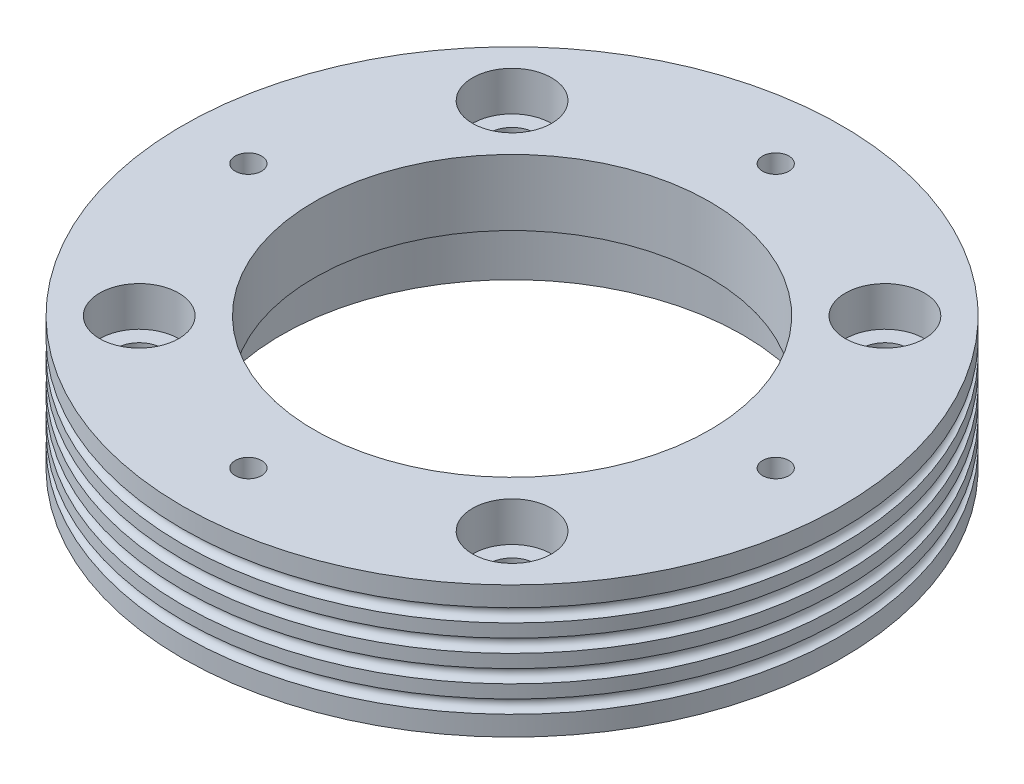
ISO-10303-21;
HEADER;
FILE_DESCRIPTION(('STEP AP214'),'2;1');
FILE_NAME('part.step','',(''),(''),'','','');
FILE_SCHEMA(('AUTOMOTIVE_DESIGN { 1 0 10303 214 1 1 1 1 }'));
ENDSEC;
DATA;
#1=APPLICATION_CONTEXT('core data for automotive mechanical design processes');
#2=APPLICATION_PROTOCOL_DEFINITION('international standard','automotive_design',2000,#1);
#3=PRODUCT_CONTEXT('',#1,'mechanical');
#4=PRODUCT('Part','Part','',(#3));
#5=PRODUCT_RELATED_PRODUCT_CATEGORY('part','',(#4));
#6=PRODUCT_DEFINITION_FORMATION('','',#4);
#7=PRODUCT_DEFINITION_CONTEXT('part definition',#1,'design');
#8=PRODUCT_DEFINITION('design','',#6,#7);
#9=PRODUCT_DEFINITION_SHAPE('','',#8);
#10=(LENGTH_UNIT() NAMED_UNIT(*) SI_UNIT(.MILLI.,.METRE.));
#11=(NAMED_UNIT(*) PLANE_ANGLE_UNIT() SI_UNIT($,.RADIAN.));
#12=(NAMED_UNIT(*) SI_UNIT($,.STERADIAN.) SOLID_ANGLE_UNIT());
#13=UNCERTAINTY_MEASURE_WITH_UNIT(LENGTH_MEASURE(1.E-05),#10,'distance_accuracy_value','');
#14=(GEOMETRIC_REPRESENTATION_CONTEXT(3) GLOBAL_UNCERTAINTY_ASSIGNED_CONTEXT((#13)) GLOBAL_UNIT_ASSIGNED_CONTEXT((#10,
#11,#12)) REPRESENTATION_CONTEXT('',''));
#15=CARTESIAN_POINT('',(0.,0.,0.));
#16=DIRECTION('',(0.,0.,1.));
#17=DIRECTION('',(1.,0.,0.));
#18=AXIS2_PLACEMENT_3D('',#15,#16,#17);
#19=CARTESIAN_POINT('',(0.,10.,0.));
#20=DIRECTION('',(0.,-1.,0.));
#21=DIRECTION('',(0.,0.,-1.));
#22=AXIS2_PLACEMENT_3D('',#19,#20,#21);
#23=CYLINDRICAL_SURFACE('',#22,25.);
#24=CARTESIAN_POINT('',(0.,8.5,0.));
#25=DIRECTION('',(0.,-1.,0.));
#26=DIRECTION('',(0.,0.,-1.));
#27=AXIS2_PLACEMENT_3D('',#24,#25,#26);
#28=CIRCLE('',#27,25.);
#29=CARTESIAN_POINT('',(0.,8.5,25.));
#30=VERTEX_POINT('',#29);
#31=EDGE_CURVE('E12',#30,#30,#28,.F.);
#32=ORIENTED_EDGE('',*,*,#31,.T.);
#33=EDGE_LOOP('',(#32));
#34=FACE_BOUND('',#33,.T.);
#35=CARTESIAN_POINT('',(0.,10.,0.));
#36=DIRECTION('',(0.,1.,0.));
#37=DIRECTION('',(0.,0.,1.));
#38=AXIS2_PLACEMENT_3D('',#35,#36,#37);
#39=CIRCLE('',#38,25.);
#40=CARTESIAN_POINT('',(0.,10.,25.));
#41=VERTEX_POINT('',#40);
#42=EDGE_CURVE('E225',#41,#41,#39,.T.);
#43=ORIENTED_EDGE('',*,*,#42,.F.);
#44=EDGE_LOOP('',(#43));
#45=FACE_BOUND('',#44,.T.);
#46=ADVANCED_FACE('F91',(#34,#45),#23,.T.);
#47=CARTESIAN_POINT('',(0.,7.5,0.));
#48=DIRECTION('',(0.,1.,0.));
#49=DIRECTION('',(0.,0.,1.));
#50=AXIS2_PLACEMENT_3D('',#47,#48,#49);
#51=CIRCLE('',#50,25.);
#52=CARTESIAN_POINT('',(0.,7.5,25.));
#53=VERTEX_POINT('',#52);
#54=EDGE_CURVE('E99',#53,#53,#51,.F.);
#55=ORIENTED_EDGE('',*,*,#54,.T.);
#56=EDGE_LOOP('',(#55));
#57=FACE_BOUND('',#56,.T.);
#58=CARTESIAN_POINT('',(0.,6.5,0.));
#59=DIRECTION('',(0.,-1.,0.));
#60=DIRECTION('',(0.,0.,-1.));
#61=AXIS2_PLACEMENT_3D('',#58,#59,#60);
#62=CIRCLE('',#61,25.);
#63=CARTESIAN_POINT('',(0.,6.5,25.));
#64=VERTEX_POINT('',#63);
#65=EDGE_CURVE('E241',#64,#64,#62,.F.);
#66=ORIENTED_EDGE('',*,*,#65,.T.);
#67=EDGE_LOOP('',(#66));
#68=FACE_BOUND('',#67,.T.);
#69=ADVANCED_FACE('F245',(#57,#68),#23,.T.);
#70=CARTESIAN_POINT('',(0.,5.5,0.));
#71=DIRECTION('',(0.,1.,0.));
#72=DIRECTION('',(0.,0.,1.));
#73=AXIS2_PLACEMENT_3D('',#70,#71,#72);
#74=CIRCLE('',#73,25.);
#75=CARTESIAN_POINT('',(0.,5.5,25.));
#76=VERTEX_POINT('',#75);
#77=EDGE_CURVE('E238',#76,#76,#74,.F.);
#78=ORIENTED_EDGE('',*,*,#77,.T.);
#79=EDGE_LOOP('',(#78));
#80=FACE_BOUND('',#79,.T.);
#81=CARTESIAN_POINT('',(0.,4.5,0.));
#82=DIRECTION('',(0.,-1.,0.));
#83=DIRECTION('',(0.,0.,-1.));
#84=AXIS2_PLACEMENT_3D('',#81,#82,#83);
#85=CIRCLE('',#84,25.);
#86=CARTESIAN_POINT('',(0.,4.5,25.));
#87=VERTEX_POINT('',#86);
#88=EDGE_CURVE('E235',#87,#87,#85,.F.);
#89=ORIENTED_EDGE('',*,*,#88,.T.);
#90=EDGE_LOOP('',(#89));
#91=FACE_BOUND('',#90,.T.);
#92=ADVANCED_FACE('F263',(#80,#91),#23,.T.);
#93=CARTESIAN_POINT('',(0.,3.5,0.));
#94=DIRECTION('',(0.,1.,0.));
#95=DIRECTION('',(0.,0.,1.));
#96=AXIS2_PLACEMENT_3D('',#93,#94,#95);
#97=CIRCLE('',#96,25.);
#98=CARTESIAN_POINT('',(0.,3.5,25.));
#99=VERTEX_POINT('',#98);
#100=EDGE_CURVE('E232',#99,#99,#97,.F.);
#101=ORIENTED_EDGE('',*,*,#100,.T.);
#102=EDGE_LOOP('',(#101));
#103=FACE_BOUND('',#102,.T.);
#104=CARTESIAN_POINT('',(0.,2.5,0.));
#105=DIRECTION('',(0.,-1.,0.));
#106=DIRECTION('',(0.,0.,-1.));
#107=AXIS2_PLACEMENT_3D('',#104,#105,#106);
#108=CIRCLE('',#107,25.);
#109=CARTESIAN_POINT('',(0.,2.5,25.));
#110=VERTEX_POINT('',#109);
#111=EDGE_CURVE('E133',#110,#110,#108,.F.);
#112=ORIENTED_EDGE('',*,*,#111,.T.);
#113=EDGE_LOOP('',(#112));
#114=FACE_BOUND('',#113,.T.);
#115=ADVANCED_FACE('F267',(#103,#114),#23,.T.);
#116=CARTESIAN_POINT('',(0.,1.5,0.));
#117=DIRECTION('',(0.,1.,0.));
#118=DIRECTION('',(0.,0.,1.));
#119=AXIS2_PLACEMENT_3D('',#116,#117,#118);
#120=CIRCLE('',#119,25.);
#121=CARTESIAN_POINT('',(0.,1.5,25.));
#122=VERTEX_POINT('',#121);
#123=EDGE_CURVE('E131',#122,#122,#120,.F.);
#124=ORIENTED_EDGE('',*,*,#123,.T.);
#125=EDGE_LOOP('',(#124));
#126=FACE_BOUND('',#125,.T.);
#127=CARTESIAN_POINT('',(0.,0.,0.));
#128=DIRECTION('',(0.,1.,0.));
#129=DIRECTION('',(0.,0.,1.));
#130=AXIS2_PLACEMENT_3D('',#127,#128,#129);
#131=CIRCLE('',#130,25.);
#132=CARTESIAN_POINT('',(0.,0.,25.));
#133=VERTEX_POINT('',#132);
#134=EDGE_CURVE('E224',#133,#133,#131,.T.);
#135=ORIENTED_EDGE('',*,*,#134,.T.);
#136=EDGE_LOOP('',(#135));
#137=FACE_BOUND('',#136,.T.);
#138=ADVANCED_FACE('F93',(#126,#137),#23,.T.);
#139=CARTESIAN_POINT('',(0.,10.,0.));
#140=DIRECTION('',(0.,1.,0.));
#141=DIRECTION('',(0.,0.,1.));
#142=AXIS2_PLACEMENT_3D('',#139,#140,#141);
#143=PLANE('',#142);
#144=CARTESIAN_POINT('',(14.1421356237309,10.,-14.142135623731));
#145=DIRECTION('',(0.,1.,0.));
#146=DIRECTION('',(0.,0.,1.));
#147=AXIS2_PLACEMENT_3D('',#144,#145,#146);
#148=CIRCLE('',#147,3.00000000000001);
#149=CARTESIAN_POINT('',(14.1421356237309,10.,-11.142135623731));
#150=VERTEX_POINT('',#149);
#151=EDGE_CURVE('E134',#150,#150,#148,.T.);
#152=ORIENTED_EDGE('',*,*,#151,.F.);
#153=EDGE_LOOP('',(#152));
#154=FACE_BOUND('',#153,.T.);
#155=CARTESIAN_POINT('',(14.142135623731,10.,14.1421356237309));
#156=DIRECTION('',(0.,1.,0.));
#157=DIRECTION('',(0.,0.,1.));
#158=AXIS2_PLACEMENT_3D('',#155,#156,#157);
#159=CIRCLE('',#158,3.00000000000001);
#160=CARTESIAN_POINT('',(14.142135623731,10.,17.1421356237309));
#161=VERTEX_POINT('',#160);
#162=EDGE_CURVE('E152',#161,#161,#159,.T.);
#163=ORIENTED_EDGE('',*,*,#162,.F.);
#164=EDGE_LOOP('',(#163));
#165=FACE_BOUND('',#164,.T.);
#166=CARTESIAN_POINT('',(-14.142135623731,10.,14.1421356237309));
#167=DIRECTION('',(0.,1.,0.));
#168=DIRECTION('',(0.,0.,1.));
#169=AXIS2_PLACEMENT_3D('',#166,#167,#168);
#170=CIRCLE('',#169,3.00000000000001);
#171=CARTESIAN_POINT('',(-14.142135623731,10.,17.1421356237309));
#172=VERTEX_POINT('',#171);
#173=EDGE_CURVE('E164',#172,#172,#170,.T.);
#174=ORIENTED_EDGE('',*,*,#173,.F.);
#175=EDGE_LOOP('',(#174));
#176=FACE_BOUND('',#175,.T.);
#177=CARTESIAN_POINT('',(-14.1421356237308,10.,-14.1421356237311));
#178=DIRECTION('',(0.,1.,0.));
#179=DIRECTION('',(0.,0.,1.));
#180=AXIS2_PLACEMENT_3D('',#177,#178,#179);
#181=CIRCLE('',#180,3.00000000000001);
#182=CARTESIAN_POINT('',(-14.1421356237308,10.,-11.1421356237311));
#183=VERTEX_POINT('',#182);
#184=EDGE_CURVE('E176',#183,#183,#181,.T.);
#185=ORIENTED_EDGE('',*,*,#184,.F.);
#186=EDGE_LOOP('',(#185));
#187=FACE_BOUND('',#186,.T.);
#188=CARTESIAN_POINT('',(0.,10.,0.));
#189=DIRECTION('',(0.,-1.,0.));
#190=DIRECTION('',(0.,0.,-1.));
#191=AXIS2_PLACEMENT_3D('',#188,#189,#190);
#192=CIRCLE('',#191,15.);
#193=CARTESIAN_POINT('',(0.,10.,-15.));
#194=VERTEX_POINT('',#193);
#195=EDGE_CURVE('E189',#194,#194,#192,.T.);
#196=ORIENTED_EDGE('',*,*,#195,.T.);
#197=EDGE_LOOP('',(#196));
#198=FACE_BOUND('',#197,.T.);
#199=CARTESIAN_POINT('',(20.,10.,0.));
#200=DIRECTION('',(0.,1.,0.));
#201=DIRECTION('',(0.,0.,1.));
#202=AXIS2_PLACEMENT_3D('',#199,#200,#201);
#203=CIRCLE('',#202,1.00000000000001);
#204=CARTESIAN_POINT('',(20.,10.,1.00000000000001));
#205=VERTEX_POINT('',#204);
#206=EDGE_CURVE('E198',#205,#205,#203,.T.);
#207=ORIENTED_EDGE('',*,*,#206,.F.);
#208=EDGE_LOOP('',(#207));
#209=FACE_BOUND('',#208,.T.);
#210=CARTESIAN_POINT('',(0.,10.,-20.));
#211=DIRECTION('',(0.,1.,0.));
#212=DIRECTION('',(0.,0.,1.));
#213=AXIS2_PLACEMENT_3D('',#210,#211,#212);
#214=CIRCLE('',#213,1.00000000000001);
#215=CARTESIAN_POINT('',(0.,10.,-19.));
#216=VERTEX_POINT('',#215);
#217=EDGE_CURVE('E206',#216,#216,#214,.T.);
#218=ORIENTED_EDGE('',*,*,#217,.F.);
#219=EDGE_LOOP('',(#218));
#220=FACE_BOUND('',#219,.T.);
#221=CARTESIAN_POINT('',(-20.,10.,0.));
#222=DIRECTION('',(0.,1.,0.));
#223=DIRECTION('',(0.,0.,1.));
#224=AXIS2_PLACEMENT_3D('',#221,#222,#223);
#225=CIRCLE('',#224,1.00000000000001);
#226=CARTESIAN_POINT('',(-20.,10.,1.00000000000001));
#227=VERTEX_POINT('',#226);
#228=EDGE_CURVE('E212',#227,#227,#225,.T.);
#229=ORIENTED_EDGE('',*,*,#228,.F.);
#230=EDGE_LOOP('',(#229));
#231=FACE_BOUND('',#230,.T.);
#232=CARTESIAN_POINT('',(0.,10.,20.));
#233=DIRECTION('',(0.,1.,0.));
#234=DIRECTION('',(0.,0.,1.));
#235=AXIS2_PLACEMENT_3D('',#232,#233,#234);
#236=CIRCLE('',#235,1.00000000000001);
#237=CARTESIAN_POINT('',(0.,10.,21.));
#238=VERTEX_POINT('',#237);
#239=EDGE_CURVE('E218',#238,#238,#236,.T.);
#240=ORIENTED_EDGE('',*,*,#239,.F.);
#241=EDGE_LOOP('',(#240));
#242=FACE_BOUND('',#241,.T.);
#243=ORIENTED_EDGE('',*,*,#42,.T.);
#244=EDGE_LOOP('',(#243));
#245=FACE_BOUND('',#244,.T.);
#246=ADVANCED_FACE('F266',(#154,#165,#176,#187,#198,#209,#220,#231,#242,#245),#143,.T.);
#247=CARTESIAN_POINT('',(0.,0.,0.));
#248=DIRECTION('',(0.,1.,0.));
#249=DIRECTION('',(0.,0.,1.));
#250=AXIS2_PLACEMENT_3D('',#247,#248,#249);
#251=PLANE('',#250);
#252=CARTESIAN_POINT('',(14.1421356237309,0.,-14.142135623731));
#253=DIRECTION('',(0.,1.,0.));
#254=DIRECTION('',(0.,0.,1.));
#255=AXIS2_PLACEMENT_3D('',#252,#253,#254);
#256=CIRCLE('',#255,1.75000000000001);
#257=CARTESIAN_POINT('',(14.1421356237309,0.,-12.392135623731));
#258=VERTEX_POINT('',#257);
#259=EDGE_CURVE('E149',#258,#258,#256,.T.);
#260=ORIENTED_EDGE('',*,*,#259,.T.);
#261=EDGE_LOOP('',(#260));
#262=FACE_BOUND('',#261,.T.);
#263=CARTESIAN_POINT('',(14.142135623731,0.,14.1421356237309));
#264=DIRECTION('',(0.,1.,0.));
#265=DIRECTION('',(0.,0.,1.));
#266=AXIS2_PLACEMENT_3D('',#263,#264,#265);
#267=CIRCLE('',#266,1.75000000000001);
#268=CARTESIAN_POINT('',(14.142135623731,0.,15.8921356237309));
#269=VERTEX_POINT('',#268);
#270=EDGE_CURVE('E161',#269,#269,#267,.T.);
#271=ORIENTED_EDGE('',*,*,#270,.T.);
#272=EDGE_LOOP('',(#271));
#273=FACE_BOUND('',#272,.T.);
#274=CARTESIAN_POINT('',(-14.142135623731,0.,14.1421356237309));
#275=DIRECTION('',(0.,1.,0.));
#276=DIRECTION('',(0.,0.,1.));
#277=AXIS2_PLACEMENT_3D('',#274,#275,#276);
#278=CIRCLE('',#277,1.75000000000001);
#279=CARTESIAN_POINT('',(-14.142135623731,0.,15.8921356237309));
#280=VERTEX_POINT('',#279);
#281=EDGE_CURVE('E173',#280,#280,#278,.T.);
#282=ORIENTED_EDGE('',*,*,#281,.T.);
#283=EDGE_LOOP('',(#282));
#284=FACE_BOUND('',#283,.T.);
#285=CARTESIAN_POINT('',(-14.1421356237308,0.,-14.1421356237311));
#286=DIRECTION('',(0.,1.,0.));
#287=DIRECTION('',(0.,0.,1.));
#288=AXIS2_PLACEMENT_3D('',#285,#286,#287);
#289=CIRCLE('',#288,1.75000000000001);
#290=CARTESIAN_POINT('',(-14.1421356237308,0.,-12.3921356237311));
#291=VERTEX_POINT('',#290);
#292=EDGE_CURVE('E185',#291,#291,#289,.T.);
#293=ORIENTED_EDGE('',*,*,#292,.T.);
#294=EDGE_LOOP('',(#293));
#295=FACE_BOUND('',#294,.T.);
#296=CARTESIAN_POINT('',(0.,0.,0.));
#297=DIRECTION('',(0.,-1.,0.));
#298=DIRECTION('',(0.,0.,-1.));
#299=AXIS2_PLACEMENT_3D('',#296,#297,#298);
#300=CIRCLE('',#299,17.5);
#301=CARTESIAN_POINT('',(0.,0.,-17.5));
#302=VERTEX_POINT('',#301);
#303=EDGE_CURVE('E192',#302,#302,#300,.T.);
#304=ORIENTED_EDGE('',*,*,#303,.F.);
#305=EDGE_LOOP('',(#304));
#306=FACE_BOUND('',#305,.T.);
#307=CARTESIAN_POINT('',(20.,0.,0.));
#308=DIRECTION('',(0.,1.,0.));
#309=DIRECTION('',(0.,0.,1.));
#310=AXIS2_PLACEMENT_3D('',#307,#308,#309);
#311=CIRCLE('',#310,1.00000000000001);
#312=CARTESIAN_POINT('',(20.,0.,1.00000000000001));
#313=VERTEX_POINT('',#312);
#314=EDGE_CURVE('E203',#313,#313,#311,.T.);
#315=ORIENTED_EDGE('',*,*,#314,.T.);
#316=EDGE_LOOP('',(#315));
#317=FACE_BOUND('',#316,.T.);
#318=CARTESIAN_POINT('',(0.,0.,-20.));
#319=DIRECTION('',(0.,1.,0.));
#320=DIRECTION('',(0.,0.,1.));
#321=AXIS2_PLACEMENT_3D('',#318,#319,#320);
#322=CIRCLE('',#321,1.00000000000001);
#323=CARTESIAN_POINT('',(0.,0.,-19.));
#324=VERTEX_POINT('',#323);
#325=EDGE_CURVE('E209',#324,#324,#322,.T.);
#326=ORIENTED_EDGE('',*,*,#325,.T.);
#327=EDGE_LOOP('',(#326));
#328=FACE_BOUND('',#327,.T.);
#329=CARTESIAN_POINT('',(-20.,0.,0.));
#330=DIRECTION('',(0.,1.,0.));
#331=DIRECTION('',(0.,0.,1.));
#332=AXIS2_PLACEMENT_3D('',#329,#330,#331);
#333=CIRCLE('',#332,1.00000000000001);
#334=CARTESIAN_POINT('',(-20.,0.,1.00000000000001));
#335=VERTEX_POINT('',#334);
#336=EDGE_CURVE('E215',#335,#335,#333,.T.);
#337=ORIENTED_EDGE('',*,*,#336,.T.);
#338=EDGE_LOOP('',(#337));
#339=FACE_BOUND('',#338,.T.);
#340=CARTESIAN_POINT('',(0.,0.,20.));
#341=DIRECTION('',(0.,1.,0.));
#342=DIRECTION('',(0.,0.,1.));
#343=AXIS2_PLACEMENT_3D('',#340,#341,#342);
#344=CIRCLE('',#343,1.00000000000001);
#345=CARTESIAN_POINT('',(0.,0.,21.));
#346=VERTEX_POINT('',#345);
#347=EDGE_CURVE('E221',#346,#346,#344,.T.);
#348=ORIENTED_EDGE('',*,*,#347,.T.);
#349=EDGE_LOOP('',(#348));
#350=FACE_BOUND('',#349,.T.);
#351=ORIENTED_EDGE('',*,*,#134,.F.);
#352=EDGE_LOOP('',(#351));
#353=FACE_BOUND('',#352,.T.);
#354=ADVANCED_FACE('F273',(#262,#273,#284,#295,#306,#317,#328,#339,#350,#353),#251,.F.);
#355=CARTESIAN_POINT('',(0.,10.,20.));
#356=DIRECTION('',(0.,1.,0.));
#357=DIRECTION('',(0.,0.,1.));
#358=AXIS2_PLACEMENT_3D('',#355,#356,#357);
#359=CYLINDRICAL_SURFACE('',#358,1.00000000000001);
#360=ORIENTED_EDGE('',*,*,#347,.F.);
#361=EDGE_LOOP('',(#360));
#362=FACE_BOUND('',#361,.T.);
#363=ORIENTED_EDGE('',*,*,#239,.T.);
#364=EDGE_LOOP('',(#363));
#365=FACE_BOUND('',#364,.T.);
#366=ADVANCED_FACE('F282',(#362,#365),#359,.F.);
#367=CARTESIAN_POINT('',(-20.,10.,0.));
#368=DIRECTION('',(0.,1.,0.));
#369=DIRECTION('',(0.,0.,1.));
#370=AXIS2_PLACEMENT_3D('',#367,#368,#369);
#371=CYLINDRICAL_SURFACE('',#370,1.00000000000001);
#372=ORIENTED_EDGE('',*,*,#336,.F.);
#373=EDGE_LOOP('',(#372));
#374=FACE_BOUND('',#373,.T.);
#375=ORIENTED_EDGE('',*,*,#228,.T.);
#376=EDGE_LOOP('',(#375));
#377=FACE_BOUND('',#376,.T.);
#378=ADVANCED_FACE('F288',(#374,#377),#371,.F.);
#379=CARTESIAN_POINT('',(0.,10.,-20.));
#380=DIRECTION('',(0.,1.,0.));
#381=DIRECTION('',(0.,0.,1.));
#382=AXIS2_PLACEMENT_3D('',#379,#380,#381);
#383=CYLINDRICAL_SURFACE('',#382,1.00000000000001);
#384=ORIENTED_EDGE('',*,*,#325,.F.);
#385=EDGE_LOOP('',(#384));
#386=FACE_BOUND('',#385,.T.);
#387=ORIENTED_EDGE('',*,*,#217,.T.);
#388=EDGE_LOOP('',(#387));
#389=FACE_BOUND('',#388,.T.);
#390=ADVANCED_FACE('F295',(#386,#389),#383,.F.);
#391=CARTESIAN_POINT('',(20.,10.,0.));
#392=DIRECTION('',(0.,1.,0.));
#393=DIRECTION('',(0.,0.,1.));
#394=AXIS2_PLACEMENT_3D('',#391,#392,#393);
#395=CYLINDRICAL_SURFACE('',#394,1.00000000000001);
#396=ORIENTED_EDGE('',*,*,#314,.F.);
#397=EDGE_LOOP('',(#396));
#398=FACE_BOUND('',#397,.T.);
#399=ORIENTED_EDGE('',*,*,#206,.T.);
#400=EDGE_LOOP('',(#399));
#401=FACE_BOUND('',#400,.T.);
#402=ADVANCED_FACE('F299',(#398,#401),#395,.F.);
#403=CARTESIAN_POINT('',(0.,5.,0.));
#404=DIRECTION('',(0.,-1.,0.));
#405=DIRECTION('',(0.,0.,-1.));
#406=AXIS2_PLACEMENT_3D('',#403,#404,#405);
#407=CYLINDRICAL_SURFACE('',#406,17.5);
#408=CARTESIAN_POINT('',(0.,5.,0.));
#409=DIRECTION('',(0.,-1.,0.));
#410=DIRECTION('',(0.,0.,-1.));
#411=AXIS2_PLACEMENT_3D('',#408,#409,#410);
#412=CIRCLE('',#411,17.5);
#413=CARTESIAN_POINT('',(0.,5.,-17.5));
#414=VERTEX_POINT('',#413);
#415=EDGE_CURVE('E195',#414,#414,#412,.T.);
#416=ORIENTED_EDGE('',*,*,#415,.F.);
#417=EDGE_LOOP('',(#416));
#418=FACE_BOUND('',#417,.T.);
#419=ORIENTED_EDGE('',*,*,#303,.T.);
#420=EDGE_LOOP('',(#419));
#421=FACE_BOUND('',#420,.T.);
#422=ADVANCED_FACE('F303',(#418,#421),#407,.F.);
#423=CARTESIAN_POINT('',(0.,5.,0.));
#424=DIRECTION('',(0.,-1.,0.));
#425=DIRECTION('',(0.,0.,-1.));
#426=AXIS2_PLACEMENT_3D('',#423,#424,#425);
#427=PLANE('',#426);
#428=CARTESIAN_POINT('',(0.,5.,0.));
#429=DIRECTION('',(0.,-1.,0.));
#430=DIRECTION('',(0.,0.,-1.));
#431=AXIS2_PLACEMENT_3D('',#428,#429,#430);
#432=CIRCLE('',#431,15.);
#433=CARTESIAN_POINT('',(0.,5.,-15.));
#434=VERTEX_POINT('',#433);
#435=EDGE_CURVE('E188',#434,#434,#432,.T.);
#436=ORIENTED_EDGE('',*,*,#435,.F.);
#437=EDGE_LOOP('',(#436));
#438=FACE_BOUND('',#437,.T.);
#439=ORIENTED_EDGE('',*,*,#415,.T.);
#440=EDGE_LOOP('',(#439));
#441=FACE_BOUND('',#440,.T.);
#442=ADVANCED_FACE('F307',(#438,#441),#427,.T.);
#443=CARTESIAN_POINT('',(0.,10.,0.));
#444=DIRECTION('',(0.,-1.,0.));
#445=DIRECTION('',(0.,0.,-1.));
#446=AXIS2_PLACEMENT_3D('',#443,#444,#445);
#447=CYLINDRICAL_SURFACE('',#446,15.);
#448=ORIENTED_EDGE('',*,*,#195,.F.);
#449=EDGE_LOOP('',(#448));
#450=FACE_BOUND('',#449,.T.);
#451=ORIENTED_EDGE('',*,*,#435,.T.);
#452=EDGE_LOOP('',(#451));
#453=FACE_BOUND('',#452,.T.);
#454=ADVANCED_FACE('F311',(#450,#453),#447,.F.);
#455=CARTESIAN_POINT('',(-14.1421356237308,10.,-14.1421356237311));
#456=DIRECTION('',(0.,1.,0.));
#457=DIRECTION('',(0.,0.,1.));
#458=AXIS2_PLACEMENT_3D('',#455,#456,#457);
#459=CYLINDRICAL_SURFACE('',#458,1.75000000000001);
#460=ORIENTED_EDGE('',*,*,#292,.F.);
#461=EDGE_LOOP('',(#460));
#462=FACE_BOUND('',#461,.T.);
#463=CARTESIAN_POINT('',(-14.1421356237308,7.,-14.1421356237311));
#464=DIRECTION('',(0.,1.,0.));
#465=DIRECTION('',(0.,0.,1.));
#466=AXIS2_PLACEMENT_3D('',#463,#464,#465);
#467=CIRCLE('',#466,1.75000000000001);
#468=CARTESIAN_POINT('',(-14.1421356237308,7.,-12.3921356237311));
#469=VERTEX_POINT('',#468);
#470=EDGE_CURVE('E182',#469,#469,#467,.T.);
#471=ORIENTED_EDGE('',*,*,#470,.T.);
#472=EDGE_LOOP('',(#471));
#473=FACE_BOUND('',#472,.T.);
#474=ADVANCED_FACE('F315',(#462,#473),#459,.F.);
#475=CARTESIAN_POINT('',(-12.3921356237308,7.,-14.1421356237311));
#476=DIRECTION('',(0.,-1.,0.));
#477=DIRECTION('',(0.,0.,-1.));
#478=AXIS2_PLACEMENT_3D('',#475,#476,#477);
#479=PLANE('',#478);
#480=ORIENTED_EDGE('',*,*,#470,.F.);
#481=EDGE_LOOP('',(#480));
#482=FACE_BOUND('',#481,.T.);
#483=CARTESIAN_POINT('',(-14.1421356237308,7.,-14.1421356237311));
#484=DIRECTION('',(0.,1.,0.));
#485=DIRECTION('',(0.,0.,1.));
#486=AXIS2_PLACEMENT_3D('',#483,#484,#485);
#487=CIRCLE('',#486,3.00000000000001);
#488=CARTESIAN_POINT('',(-14.1421356237308,7.,-11.1421356237311));
#489=VERTEX_POINT('',#488);
#490=EDGE_CURVE('E179',#489,#489,#487,.T.);
#491=ORIENTED_EDGE('',*,*,#490,.T.);
#492=EDGE_LOOP('',(#491));
#493=FACE_BOUND('',#492,.T.);
#494=ADVANCED_FACE('F318',(#482,#493),#479,.F.);
#495=CARTESIAN_POINT('',(-14.1421356237308,10.,-14.1421356237311));
#496=DIRECTION('',(0.,1.,0.));
#497=DIRECTION('',(0.,0.,1.));
#498=AXIS2_PLACEMENT_3D('',#495,#496,#497);
#499=CYLINDRICAL_SURFACE('',#498,3.00000000000001);
#500=ORIENTED_EDGE('',*,*,#490,.F.);
#501=EDGE_LOOP('',(#500));
#502=FACE_BOUND('',#501,.T.);
#503=ORIENTED_EDGE('',*,*,#184,.T.);
#504=EDGE_LOOP('',(#503));
#505=FACE_BOUND('',#504,.T.);
#506=ADVANCED_FACE('F322',(#502,#505),#499,.F.);
#507=CARTESIAN_POINT('',(-14.142135623731,10.,14.1421356237309));
#508=DIRECTION('',(0.,1.,0.));
#509=DIRECTION('',(0.,0.,1.));
#510=AXIS2_PLACEMENT_3D('',#507,#508,#509);
#511=CYLINDRICAL_SURFACE('',#510,1.75000000000001);
#512=ORIENTED_EDGE('',*,*,#281,.F.);
#513=EDGE_LOOP('',(#512));
#514=FACE_BOUND('',#513,.T.);
#515=CARTESIAN_POINT('',(-14.142135623731,7.,14.1421356237309));
#516=DIRECTION('',(0.,1.,0.));
#517=DIRECTION('',(0.,0.,1.));
#518=AXIS2_PLACEMENT_3D('',#515,#516,#517);
#519=CIRCLE('',#518,1.75000000000001);
#520=CARTESIAN_POINT('',(-14.142135623731,7.,15.8921356237309));
#521=VERTEX_POINT('',#520);
#522=EDGE_CURVE('E170',#521,#521,#519,.T.);
#523=ORIENTED_EDGE('',*,*,#522,.T.);
#524=EDGE_LOOP('',(#523));
#525=FACE_BOUND('',#524,.T.);
#526=ADVANCED_FACE('F326',(#514,#525),#511,.F.);
#527=CARTESIAN_POINT('',(-12.392135623731,7.,14.1421356237309));
#528=DIRECTION('',(0.,-1.,0.));
#529=DIRECTION('',(0.,0.,-1.));
#530=AXIS2_PLACEMENT_3D('',#527,#528,#529);
#531=PLANE('',#530);
#532=ORIENTED_EDGE('',*,*,#522,.F.);
#533=EDGE_LOOP('',(#532));
#534=FACE_BOUND('',#533,.T.);
#535=CARTESIAN_POINT('',(-14.142135623731,7.,14.1421356237309));
#536=DIRECTION('',(0.,1.,0.));
#537=DIRECTION('',(0.,0.,1.));
#538=AXIS2_PLACEMENT_3D('',#535,#536,#537);
#539=CIRCLE('',#538,3.00000000000001);
#540=CARTESIAN_POINT('',(-14.142135623731,7.,17.1421356237309));
#541=VERTEX_POINT('',#540);
#542=EDGE_CURVE('E167',#541,#541,#539,.T.);
#543=ORIENTED_EDGE('',*,*,#542,.T.);
#544=EDGE_LOOP('',(#543));
#545=FACE_BOUND('',#544,.T.);
#546=ADVANCED_FACE('F330',(#534,#545),#531,.F.);
#547=CARTESIAN_POINT('',(-14.142135623731,10.,14.1421356237309));
#548=DIRECTION('',(0.,1.,0.));
#549=DIRECTION('',(0.,0.,1.));
#550=AXIS2_PLACEMENT_3D('',#547,#548,#549);
#551=CYLINDRICAL_SURFACE('',#550,3.00000000000001);
#552=ORIENTED_EDGE('',*,*,#542,.F.);
#553=EDGE_LOOP('',(#552));
#554=FACE_BOUND('',#553,.T.);
#555=ORIENTED_EDGE('',*,*,#173,.T.);
#556=EDGE_LOOP('',(#555));
#557=FACE_BOUND('',#556,.T.);
#558=ADVANCED_FACE('F334',(#554,#557),#551,.F.);
#559=CARTESIAN_POINT('',(14.142135623731,10.,14.1421356237309));
#560=DIRECTION('',(0.,1.,0.));
#561=DIRECTION('',(0.,0.,1.));
#562=AXIS2_PLACEMENT_3D('',#559,#560,#561);
#563=CYLINDRICAL_SURFACE('',#562,1.75000000000001);
#564=ORIENTED_EDGE('',*,*,#270,.F.);
#565=EDGE_LOOP('',(#564));
#566=FACE_BOUND('',#565,.T.);
#567=CARTESIAN_POINT('',(14.142135623731,7.,14.1421356237309));
#568=DIRECTION('',(0.,1.,0.));
#569=DIRECTION('',(0.,0.,1.));
#570=AXIS2_PLACEMENT_3D('',#567,#568,#569);
#571=CIRCLE('',#570,1.75000000000001);
#572=CARTESIAN_POINT('',(14.142135623731,7.,15.8921356237309));
#573=VERTEX_POINT('',#572);
#574=EDGE_CURVE('E158',#573,#573,#571,.T.);
#575=ORIENTED_EDGE('',*,*,#574,.T.);
#576=EDGE_LOOP('',(#575));
#577=FACE_BOUND('',#576,.T.);
#578=ADVANCED_FACE('F338',(#566,#577),#563,.F.);
#579=CARTESIAN_POINT('',(15.892135623731,7.,14.1421356237309));
#580=DIRECTION('',(0.,-1.,0.));
#581=DIRECTION('',(0.,0.,-1.));
#582=AXIS2_PLACEMENT_3D('',#579,#580,#581);
#583=PLANE('',#582);
#584=ORIENTED_EDGE('',*,*,#574,.F.);
#585=EDGE_LOOP('',(#584));
#586=FACE_BOUND('',#585,.T.);
#587=CARTESIAN_POINT('',(14.142135623731,7.,14.1421356237309));
#588=DIRECTION('',(0.,1.,0.));
#589=DIRECTION('',(0.,0.,1.));
#590=AXIS2_PLACEMENT_3D('',#587,#588,#589);
#591=CIRCLE('',#590,3.00000000000001);
#592=CARTESIAN_POINT('',(14.142135623731,7.,17.1421356237309));
#593=VERTEX_POINT('',#592);
#594=EDGE_CURVE('E155',#593,#593,#591,.T.);
#595=ORIENTED_EDGE('',*,*,#594,.T.);
#596=EDGE_LOOP('',(#595));
#597=FACE_BOUND('',#596,.T.);
#598=ADVANCED_FACE('F342',(#586,#597),#583,.F.);
#599=CARTESIAN_POINT('',(14.142135623731,10.,14.1421356237309));
#600=DIRECTION('',(0.,1.,0.));
#601=DIRECTION('',(0.,0.,1.));
#602=AXIS2_PLACEMENT_3D('',#599,#600,#601);
#603=CYLINDRICAL_SURFACE('',#602,3.00000000000001);
#604=ORIENTED_EDGE('',*,*,#594,.F.);
#605=EDGE_LOOP('',(#604));
#606=FACE_BOUND('',#605,.T.);
#607=ORIENTED_EDGE('',*,*,#162,.T.);
#608=EDGE_LOOP('',(#607));
#609=FACE_BOUND('',#608,.T.);
#610=ADVANCED_FACE('F346',(#606,#609),#603,.F.);
#611=CARTESIAN_POINT('',(14.1421356237309,10.,-14.142135623731));
#612=DIRECTION('',(0.,1.,0.));
#613=DIRECTION('',(0.,0.,1.));
#614=AXIS2_PLACEMENT_3D('',#611,#612,#613);
#615=CYLINDRICAL_SURFACE('',#614,1.75000000000001);
#616=ORIENTED_EDGE('',*,*,#259,.F.);
#617=EDGE_LOOP('',(#616));
#618=FACE_BOUND('',#617,.T.);
#619=CARTESIAN_POINT('',(14.1421356237309,7.,-14.142135623731));
#620=DIRECTION('',(0.,1.,0.));
#621=DIRECTION('',(0.,0.,1.));
#622=AXIS2_PLACEMENT_3D('',#619,#620,#621);
#623=CIRCLE('',#622,1.75000000000001);
#624=CARTESIAN_POINT('',(14.1421356237309,7.,-12.392135623731));
#625=VERTEX_POINT('',#624);
#626=EDGE_CURVE('E146',#625,#625,#623,.T.);
#627=ORIENTED_EDGE('',*,*,#626,.T.);
#628=EDGE_LOOP('',(#627));
#629=FACE_BOUND('',#628,.T.);
#630=ADVANCED_FACE('F350',(#618,#629),#615,.F.);
#631=CARTESIAN_POINT('',(15.8921356237309,7.,-14.142135623731));
#632=DIRECTION('',(0.,-1.,0.));
#633=DIRECTION('',(0.,0.,-1.));
#634=AXIS2_PLACEMENT_3D('',#631,#632,#633);
#635=PLANE('',#634);
#636=ORIENTED_EDGE('',*,*,#626,.F.);
#637=EDGE_LOOP('',(#636));
#638=FACE_BOUND('',#637,.T.);
#639=CARTESIAN_POINT('',(14.1421356237309,7.,-14.142135623731));
#640=DIRECTION('',(0.,1.,0.));
#641=DIRECTION('',(0.,0.,1.));
#642=AXIS2_PLACEMENT_3D('',#639,#640,#641);
#643=CIRCLE('',#642,3.00000000000001);
#644=CARTESIAN_POINT('',(14.1421356237309,7.,-11.142135623731));
#645=VERTEX_POINT('',#644);
#646=EDGE_CURVE('E138',#645,#645,#643,.T.);
#647=ORIENTED_EDGE('',*,*,#646,.T.);
#648=EDGE_LOOP('',(#647));
#649=FACE_BOUND('',#648,.T.);
#650=ADVANCED_FACE('F354',(#638,#649),#635,.F.);
#651=CARTESIAN_POINT('',(14.1421356237309,10.,-14.142135623731));
#652=DIRECTION('',(0.,1.,0.));
#653=DIRECTION('',(0.,0.,1.));
#654=AXIS2_PLACEMENT_3D('',#651,#652,#653);
#655=CYLINDRICAL_SURFACE('',#654,3.00000000000001);
#656=ORIENTED_EDGE('',*,*,#646,.F.);
#657=EDGE_LOOP('',(#656));
#658=FACE_BOUND('',#657,.T.);
#659=ORIENTED_EDGE('',*,*,#151,.T.);
#660=EDGE_LOOP('',(#659));
#661=FACE_BOUND('',#660,.T.);
#662=ADVANCED_FACE('F358',(#658,#661),#655,.F.);
#663=CARTESIAN_POINT('',(0.,2.,0.));
#664=DIRECTION('',(0.,1.,0.));
#665=DIRECTION('',(0.,0.,1.));
#666=AXIS2_PLACEMENT_3D('',#663,#664,#665);
#667=TOROIDAL_SURFACE('',#666,25.,0.5);
#668=CARTESIAN_POINT('',(0.,2.,25.));
#669=DIRECTION('',(1.,0.,0.));
#670=DIRECTION('',(0.,0.,-1.));
#671=AXIS2_PLACEMENT_3D('',#668,#669,#670);
#672=CIRCLE('',#671,0.5);
#673=EDGE_CURVE('E128',#122,#110,#672,.T.);
#674=ORIENTED_EDGE('',*,*,#673,.F.);
#675=ORIENTED_EDGE('',*,*,#123,.F.);
#676=ORIENTED_EDGE('',*,*,#673,.T.);
#677=ORIENTED_EDGE('',*,*,#111,.F.);
#678=EDGE_LOOP('',(#674,#675,#676,#677));
#679=FACE_BOUND('',#678,.T.);
#680=ADVANCED_FACE('F129',(#679),#667,.F.);
#681=CARTESIAN_POINT('',(0.,4.,0.));
#682=DIRECTION('',(0.,1.,0.));
#683=DIRECTION('',(0.,0.,1.));
#684=AXIS2_PLACEMENT_3D('',#681,#682,#683);
#685=TOROIDAL_SURFACE('',#684,25.,0.5);
#686=CARTESIAN_POINT('',(0.,4.,25.));
#687=DIRECTION('',(1.,0.,0.));
#688=DIRECTION('',(0.,0.,-1.));
#689=AXIS2_PLACEMENT_3D('',#686,#687,#688);
#690=CIRCLE('',#689,0.5);
#691=EDGE_CURVE('E135',#99,#87,#690,.T.);
#692=ORIENTED_EDGE('',*,*,#691,.F.);
#693=ORIENTED_EDGE('',*,*,#100,.F.);
#694=ORIENTED_EDGE('',*,*,#691,.T.);
#695=ORIENTED_EDGE('',*,*,#88,.F.);
#696=EDGE_LOOP('',(#692,#693,#694,#695));
#697=FACE_BOUND('',#696,.T.);
#698=ADVANCED_FACE('F254',(#697),#685,.F.);
#699=CARTESIAN_POINT('',(0.,6.,0.));
#700=DIRECTION('',(0.,1.,0.));
#701=DIRECTION('',(0.,0.,1.));
#702=AXIS2_PLACEMENT_3D('',#699,#700,#701);
#703=TOROIDAL_SURFACE('',#702,25.,0.5);
#704=CARTESIAN_POINT('',(0.,6.,25.));
#705=DIRECTION('',(1.,0.,0.));
#706=DIRECTION('',(0.,0.,-1.));
#707=AXIS2_PLACEMENT_3D('',#704,#705,#706);
#708=CIRCLE('',#707,0.5);
#709=EDGE_CURVE('E140',#76,#64,#708,.T.);
#710=ORIENTED_EDGE('',*,*,#709,.F.);
#711=ORIENTED_EDGE('',*,*,#77,.F.);
#712=ORIENTED_EDGE('',*,*,#709,.T.);
#713=ORIENTED_EDGE('',*,*,#65,.F.);
#714=EDGE_LOOP('',(#710,#711,#712,#713));
#715=FACE_BOUND('',#714,.T.);
#716=ADVANCED_FACE('F249',(#715),#703,.F.);
#717=CARTESIAN_POINT('',(0.,8.,0.));
#718=DIRECTION('',(0.,1.,0.));
#719=DIRECTION('',(0.,0.,1.));
#720=AXIS2_PLACEMENT_3D('',#717,#718,#719);
#721=TOROIDAL_SURFACE('',#720,25.,0.5);
#722=CARTESIAN_POINT('',(0.,8.,25.));
#723=DIRECTION('',(1.,0.,0.));
#724=DIRECTION('',(0.,0.,-1.));
#725=AXIS2_PLACEMENT_3D('',#722,#723,#724);
#726=CIRCLE('',#725,0.5);
#727=EDGE_CURVE('E106',#53,#30,#726,.T.);
#728=ORIENTED_EDGE('',*,*,#727,.F.);
#729=ORIENTED_EDGE('',*,*,#54,.F.);
#730=ORIENTED_EDGE('',*,*,#727,.T.);
#731=ORIENTED_EDGE('',*,*,#31,.F.);
#732=EDGE_LOOP('',(#728,#729,#730,#731));
#733=FACE_BOUND('',#732,.T.);
#734=ADVANCED_FACE('F247',(#733),#721,.F.);
#735=CLOSED_SHELL('',(#46,#69,#92,#115,#138,#246,#354,#366,#378,#390,#402,#422,#442,#454,#474,
#494,#506,#526,#546,#558,#578,#598,#610,#630,#650,#662,#680,#698,#716,#734));
#736=MANIFOLD_SOLID_BREP('B2',#735);
#737=ADVANCED_BREP_SHAPE_REPRESENTATION('',(#18,#736),#14);
#738=SHAPE_DEFINITION_REPRESENTATION(#9,#737);
ENDSEC;
END-ISO-10303-21;
